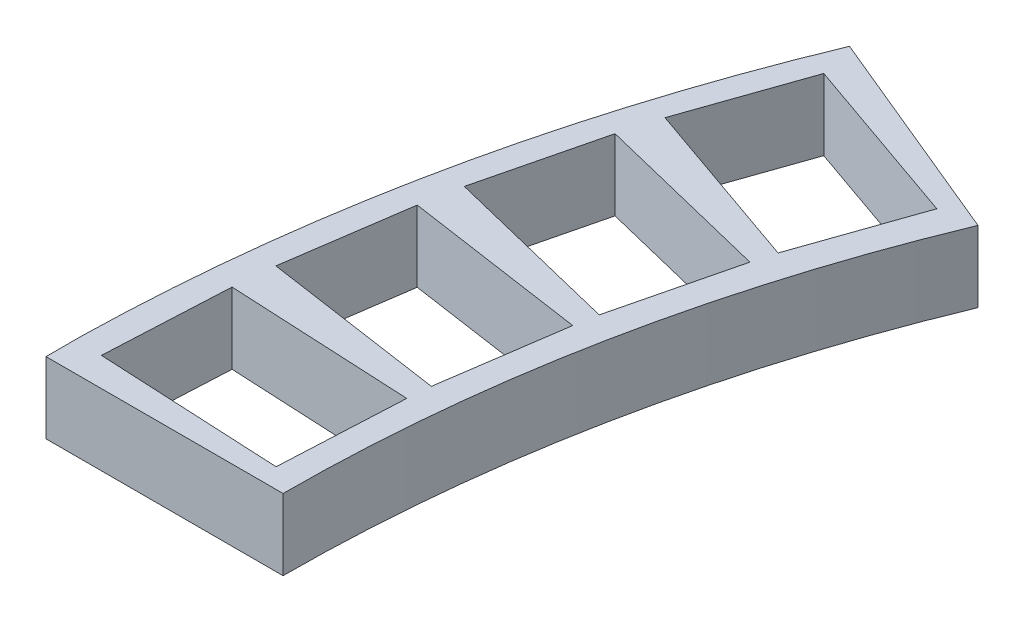
ISO-10303-21;
HEADER;
FILE_DESCRIPTION(('STEP AP214'),'2;1');
FILE_NAME('part.step','',(''),(''),'','','');
FILE_SCHEMA(('AUTOMOTIVE_DESIGN { 1 0 10303 214 1 1 1 1 }'));
ENDSEC;
DATA;
#1=APPLICATION_CONTEXT('core data for automotive mechanical design processes');
#2=APPLICATION_PROTOCOL_DEFINITION('international standard','automotive_design',2000,#1);
#3=PRODUCT_CONTEXT('',#1,'mechanical');
#4=PRODUCT('Part','Part','',(#3));
#5=PRODUCT_RELATED_PRODUCT_CATEGORY('part','',(#4));
#6=PRODUCT_DEFINITION_FORMATION('','',#4);
#7=PRODUCT_DEFINITION_CONTEXT('part definition',#1,'design');
#8=PRODUCT_DEFINITION('design','',#6,#7);
#9=PRODUCT_DEFINITION_SHAPE('','',#8);
#10=(LENGTH_UNIT() NAMED_UNIT(*) SI_UNIT(.MILLI.,.METRE.));
#11=(NAMED_UNIT(*) PLANE_ANGLE_UNIT() SI_UNIT($,.RADIAN.));
#12=(NAMED_UNIT(*) SI_UNIT($,.STERADIAN.) SOLID_ANGLE_UNIT());
#13=UNCERTAINTY_MEASURE_WITH_UNIT(LENGTH_MEASURE(1.E-05),#10,'distance_accuracy_value','');
#14=(GEOMETRIC_REPRESENTATION_CONTEXT(3) GLOBAL_UNCERTAINTY_ASSIGNED_CONTEXT((#13)) GLOBAL_UNIT_ASSIGNED_CONTEXT((#10,
#11,#12)) REPRESENTATION_CONTEXT('',''));
#15=CARTESIAN_POINT('',(0.,0.,0.));
#16=DIRECTION('',(0.,0.,1.));
#17=DIRECTION('',(1.,0.,0.));
#18=AXIS2_PLACEMENT_3D('',#15,#16,#17);
#19=CARTESIAN_POINT('',(0.,12.,0.));
#20=DIRECTION('',(0.,-1.,0.));
#21=DIRECTION('',(0.,0.,-1.));
#22=AXIS2_PLACEMENT_3D('',#19,#20,#21);
#23=PLANE('',#22);
#24=DIRECTION('',(0.998775470850136,0.,0.0494728089771555));
#25=VECTOR('',#24,1.);
#26=CARTESIAN_POINT('',(-259.677683337546,12.,-3.31462064663184));
#27=LINE('',#26,#25);
#28=CARTESIAN_POINT('',(-290.6397229339,12.,-4.84827772492366));
#29=VERTEX_POINT('',#28);
#30=CARTESIAN_POINT('',(-259.677683337546,12.,-3.31462064663184));
#31=VERTEX_POINT('',#30);
#32=EDGE_CURVE('E231',#29,#31,#27,.T.);
#33=ORIENTED_EDGE('',*,*,#32,.F.);
#34=DIRECTION('',(-0.0494728089771553,0.,0.998775470850135));
#35=VECTOR('',#34,1.);
#36=CARTESIAN_POINT('',(-290.6397229339,12.,-4.84827772492366));
#37=LINE('',#36,#35);
#38=CARTESIAN_POINT('',(-289.60079394538,12.,-25.8225626127765));
#39=VERTEX_POINT('',#38);
#40=EDGE_CURVE('E242',#39,#29,#37,.T.);
#41=ORIENTED_EDGE('',*,*,#40,.F.);
#42=DIRECTION('',(-0.998775470850136,0.,-0.0494728089771557));
#43=VECTOR('',#42,1.);
#44=CARTESIAN_POINT('',(-289.60079394538,12.,-25.8225626127765));
#45=LINE('',#44,#43);
#46=CARTESIAN_POINT('',(-258.638754349026,12.,-24.2889055344847));
#47=VERTEX_POINT('',#46);
#48=EDGE_CURVE('E238',#47,#39,#45,.T.);
#49=ORIENTED_EDGE('',*,*,#48,.F.);
#50=DIRECTION('',(0.0494728089771553,0.,-0.998775470850135));
#51=VECTOR('',#50,1.);
#52=CARTESIAN_POINT('',(-258.638754349026,12.,-24.2889055344847));
#53=LINE('',#52,#51);
#54=EDGE_CURVE('E234',#31,#47,#53,.T.);
#55=ORIENTED_EDGE('',*,*,#54,.F.);
#56=EDGE_LOOP('',(#33,#41,#49,#55));
#57=FACE_BOUND('',#56,.T.);
#58=DIRECTION('',(0.97123518890275,0.,0.238122253972701));
#59=VECTOR('',#58,1.);
#60=CARTESIAN_POINT('',(-254.615566778779,12.,-52.6883531890566));
#61=LINE('',#60,#59);
#62=CARTESIAN_POINT('',(-284.723857634765,12.,-60.0701430622103));
#63=VERTEX_POINT('',#62);
#64=CARTESIAN_POINT('',(-254.615566778779,12.,-52.6883531890566));
#65=VERTEX_POINT('',#64);
#66=EDGE_CURVE('E317',#63,#65,#61,.T.);
#67=ORIENTED_EDGE('',*,*,#66,.F.);
#68=DIRECTION('',(-0.238122253972697,0.,0.971235188902751));
#69=VECTOR('',#68,1.);
#70=CARTESIAN_POINT('',(-284.723857634765,12.,-60.0701430622103));
#71=LINE('',#70,#69);
#72=CARTESIAN_POINT('',(-279.723290301338,12.,-80.4660820291681));
#73=VERTEX_POINT('',#72);
#74=EDGE_CURVE('E328',#73,#63,#71,.T.);
#75=ORIENTED_EDGE('',*,*,#74,.F.);
#76=DIRECTION('',(-0.97123518890275,0.,-0.238122253972701));
#77=VECTOR('',#76,1.);
#78=CARTESIAN_POINT('',(-279.723290301338,12.,-80.4660820291681));
#79=LINE('',#78,#77);
#80=CARTESIAN_POINT('',(-249.614999445353,12.,-73.0842921560143));
#81=VERTEX_POINT('',#80);
#82=EDGE_CURVE('E324',#81,#73,#79,.T.);
#83=ORIENTED_EDGE('',*,*,#82,.F.);
#84=DIRECTION('',(0.238122253972699,0.,-0.971235188902751));
#85=VECTOR('',#84,1.);
#86=CARTESIAN_POINT('',(-249.614999445353,12.,-73.0842921560143));
#87=LINE('',#86,#85);
#88=EDGE_CURVE('E320',#65,#81,#87,.T.);
#89=ORIENTED_EDGE('',*,*,#88,.F.);
#90=EDGE_LOOP('',(#67,#75,#83,#89));
#91=FACE_BOUND('',#90,.T.);
#92=CARTESIAN_POINT('',(0.,12.,0.));
#93=DIRECTION('',(0.,1.,0.));
#94=DIRECTION('',(0.,0.,-1.));
#95=AXIS2_PLACEMENT_3D('',#92,#93,#94);
#96=CIRCLE('',#95,295.189854561563);
#97=CARTESIAN_POINT('',(-272.719864834412,12.,-112.964266742971));
#98=VERTEX_POINT('',#97);
#99=CARTESIAN_POINT('',(-295.127762341236,12.,-6.0542655650463));
#100=VERTEX_POINT('',#99);
#101=EDGE_CURVE('E360',#98,#100,#96,.T.);
#102=ORIENTED_EDGE('',*,*,#101,.T.);
#103=DIRECTION('',(0.,0.,1.));
#104=VECTOR('',#103,1.);
#105=CARTESIAN_POINT('',(-295.127762341236,12.,-6.0542655650463));
#106=LINE('',#105,#104);
#107=CARTESIAN_POINT('',(-295.127762341235,12.,-3.79080447587832E-12));
#108=VERTEX_POINT('',#107);
#109=EDGE_CURVE('E364',#100,#108,#106,.T.);
#110=ORIENTED_EDGE('',*,*,#109,.T.);
#111=DIRECTION('',(1.,0.,0.));
#112=VECTOR('',#111,1.);
#113=CARTESIAN_POINT('',(-295.127762341235,12.,-3.79080447587832E-12));
#114=LINE('',#113,#112);
#115=CARTESIAN_POINT('',(-255.189832201051,12.,0.));
#116=VERTEX_POINT('',#115);
#117=EDGE_CURVE('E368',#108,#116,#114,.T.);
#118=ORIENTED_EDGE('',*,*,#117,.T.);
#119=CARTESIAN_POINT('',(0.,12.,0.));
#120=DIRECTION('',(0.,-1.,0.));
#121=DIRECTION('',(0.,0.,1.));
#122=AXIS2_PLACEMENT_3D('',#119,#120,#121);
#123=CIRCLE('',#122,255.189832201051);
#124=CARTESIAN_POINT('',(-235.764662875541,12.,-97.6569208913699));
#125=VERTEX_POINT('',#124);
#126=EDGE_CURVE('E371',#116,#125,#123,.T.);
#127=ORIENTED_EDGE('',*,*,#126,.T.);
#128=DIRECTION('',(-0.923879532511287,0.,-0.38268343236509));
#129=VECTOR('',#128,1.);
#130=CARTESIAN_POINT('',(-272.719864834412,12.,-112.964266742971));
#131=LINE('',#130,#129);
#132=EDGE_CURVE('E374',#125,#98,#131,.T.);
#133=ORIENTED_EDGE('',*,*,#132,.T.);
#134=EDGE_LOOP('',(#102,#110,#118,#127,#133));
#135=FACE_BOUND('',#134,.T.);
#136=DIRECTION('',(0.989511320379551,0.,0.144455345490287));
#137=VECTOR('',#136,1.);
#138=CARTESIAN_POINT('',(-258.325942442025,12.,-28.1223982151977));
#139=LINE('',#138,#137);
#140=CARTESIAN_POINT('',(-289.000793373791,12.,-32.6005139253966));
#141=VERTEX_POINT('',#140);
#142=CARTESIAN_POINT('',(-258.325942442025,12.,-28.1223982151977));
#143=VERTEX_POINT('',#142);
#144=EDGE_CURVE('E274',#141,#143,#139,.T.);
#145=ORIENTED_EDGE('',*,*,#144,.F.);
#146=DIRECTION('',(-0.144455345490286,0.,0.989511320379551));
#147=VECTOR('',#146,1.);
#148=CARTESIAN_POINT('',(-289.000793373791,12.,-32.6005139253966));
#149=LINE('',#148,#147);
#150=CARTESIAN_POINT('',(-285.967231118495,12.,-53.3802516533672));
#151=VERTEX_POINT('',#150);
#152=EDGE_CURVE('E285',#151,#141,#149,.T.);
#153=ORIENTED_EDGE('',*,*,#152,.F.);
#154=DIRECTION('',(-0.989511320379551,0.,-0.144455345490288));
#155=VECTOR('',#154,1.);
#156=CARTESIAN_POINT('',(-285.967231118495,12.,-53.3802516533672));
#157=LINE('',#156,#155);
#158=CARTESIAN_POINT('',(-255.292380186729,12.,-48.9021359431683));
#159=VERTEX_POINT('',#158);
#160=EDGE_CURVE('E281',#159,#151,#157,.T.);
#161=ORIENTED_EDGE('',*,*,#160,.F.);
#162=DIRECTION('',(0.144455345490286,0.,-0.989511320379551));
#163=VECTOR('',#162,1.);
#164=CARTESIAN_POINT('',(-255.292380186729,12.,-48.9021359431683));
#165=LINE('',#164,#163);
#166=EDGE_CURVE('E277',#143,#159,#165,.T.);
#167=ORIENTED_EDGE('',*,*,#166,.F.);
#168=EDGE_LOOP('',(#145,#153,#161,#167));
#169=FACE_BOUND('',#168,.T.);
#170=DIRECTION('',(0.944113526410091,0.,0.329620462425351));
#171=VECTOR('',#170,1.);
#172=CARTESIAN_POINT('',(-248.580348619121,12.,-76.7887509680434));
#173=LINE('',#172,#171);
#174=CARTESIAN_POINT('',(-277.847867937834,12.,-87.0069853032293));
#175=VERTEX_POINT('',#174);
#176=CARTESIAN_POINT('',(-248.580348619121,12.,-76.7887509680434));
#177=VERTEX_POINT('',#176);
#178=EDGE_CURVE('E183',#175,#177,#173,.T.);
#179=ORIENTED_EDGE('',*,*,#178,.F.);
#180=DIRECTION('',(-0.329620462425351,0.,0.944113526410091));
#181=VECTOR('',#180,1.);
#182=CARTESIAN_POINT('',(-277.847867937834,12.,-87.0069853032293));
#183=LINE('',#182,#181);
#184=CARTESIAN_POINT('',(-270.925838226901,12.,-106.833369357841));
#185=VERTEX_POINT('',#184);
#186=EDGE_CURVE('E209',#185,#175,#183,.T.);
#187=ORIENTED_EDGE('',*,*,#186,.F.);
#188=DIRECTION('',(-0.944113526410091,0.,-0.329620462425351));
#189=VECTOR('',#188,1.);
#190=CARTESIAN_POINT('',(-270.925838226901,12.,-106.833369357841));
#191=LINE('',#190,#189);
#192=CARTESIAN_POINT('',(-241.658318908188,12.,-96.6151350226553));
#193=VERTEX_POINT('',#192);
#194=EDGE_CURVE('E205',#193,#185,#191,.T.);
#195=ORIENTED_EDGE('',*,*,#194,.F.);
#196=DIRECTION('',(0.329620462425351,0.,-0.944113526410091));
#197=VECTOR('',#196,1.);
#198=CARTESIAN_POINT('',(-241.658318908188,12.,-96.6151350226553));
#199=LINE('',#198,#197);
#200=EDGE_CURVE('E192',#177,#193,#199,.T.);
#201=ORIENTED_EDGE('',*,*,#200,.F.);
#202=EDGE_LOOP('',(#179,#187,#195,#201));
#203=FACE_BOUND('',#202,.T.);
#204=ADVANCED_FACE('F39',(#57,#91,#135,#169,#203),#23,.F.);
#205=CARTESIAN_POINT('',(0.,0.,0.));
#206=DIRECTION('',(0.,-1.,0.));
#207=DIRECTION('',(0.,0.,-1.));
#208=AXIS2_PLACEMENT_3D('',#205,#206,#207);
#209=PLANE('',#208);
#210=CARTESIAN_POINT('',(0.,0.,0.));
#211=DIRECTION('',(0.,1.,0.));
#212=DIRECTION('',(0.,0.,-1.));
#213=AXIS2_PLACEMENT_3D('',#210,#211,#212);
#214=CIRCLE('',#213,295.189854561563);
#215=CARTESIAN_POINT('',(-272.719864834412,0.,-112.964266742971));
#216=VERTEX_POINT('',#215);
#217=CARTESIAN_POINT('',(-295.127762341236,0.,-6.0542655650463));
#218=VERTEX_POINT('',#217);
#219=EDGE_CURVE('E359',#216,#218,#214,.T.);
#220=ORIENTED_EDGE('',*,*,#219,.F.);
#221=DIRECTION('',(-0.923879532511287,0.,-0.38268343236509));
#222=VECTOR('',#221,1.);
#223=CARTESIAN_POINT('',(-272.719864834412,0.,-112.964266742971));
#224=LINE('',#223,#222);
#225=CARTESIAN_POINT('',(-235.764662875541,0.,-97.6569208913699));
#226=VERTEX_POINT('',#225);
#227=EDGE_CURVE('E365',#226,#216,#224,.T.);
#228=ORIENTED_EDGE('',*,*,#227,.F.);
#229=CARTESIAN_POINT('',(0.,0.,0.));
#230=DIRECTION('',(0.,-1.,0.));
#231=DIRECTION('',(0.,0.,1.));
#232=AXIS2_PLACEMENT_3D('',#229,#230,#231);
#233=CIRCLE('',#232,255.189832201051);
#234=CARTESIAN_POINT('',(-255.189832201051,0.,0.));
#235=VERTEX_POINT('',#234);
#236=EDGE_CURVE('E387',#235,#226,#233,.T.);
#237=ORIENTED_EDGE('',*,*,#236,.F.);
#238=DIRECTION('',(1.,0.,0.));
#239=VECTOR('',#238,1.);
#240=CARTESIAN_POINT('',(-295.127762341235,0.,-3.79080447587832E-12));
#241=LINE('',#240,#239);
#242=CARTESIAN_POINT('',(-295.127762341235,0.,-3.79080447587832E-12));
#243=VERTEX_POINT('',#242);
#244=EDGE_CURVE('E384',#243,#235,#241,.T.);
#245=ORIENTED_EDGE('',*,*,#244,.F.);
#246=DIRECTION('',(0.,0.,1.));
#247=VECTOR('',#246,1.);
#248=CARTESIAN_POINT('',(-295.127762341236,0.,-6.0542655650463));
#249=LINE('',#248,#247);
#250=EDGE_CURVE('E381',#218,#243,#249,.T.);
#251=ORIENTED_EDGE('',*,*,#250,.F.);
#252=EDGE_LOOP('',(#220,#228,#237,#245,#251));
#253=FACE_BOUND('',#252,.T.);
#254=DIRECTION('',(-0.238122253972697,0.,0.971235188902751));
#255=VECTOR('',#254,1.);
#256=CARTESIAN_POINT('',(-284.723857634765,0.,-60.0701430622103));
#257=LINE('',#256,#255);
#258=CARTESIAN_POINT('',(-279.723290301338,0.,-80.4660820291681));
#259=VERTEX_POINT('',#258);
#260=CARTESIAN_POINT('',(-284.723857634765,0.,-60.0701430622103));
#261=VERTEX_POINT('',#260);
#262=EDGE_CURVE('E321',#259,#261,#257,.T.);
#263=ORIENTED_EDGE('',*,*,#262,.T.);
#264=DIRECTION('',(0.97123518890275,0.,0.238122253972701));
#265=VECTOR('',#264,1.);
#266=CARTESIAN_POINT('',(-254.615566778779,0.,-52.6883531890566));
#267=LINE('',#266,#265);
#268=CARTESIAN_POINT('',(-254.615566778779,0.,-52.6883531890566));
#269=VERTEX_POINT('',#268);
#270=EDGE_CURVE('E316',#261,#269,#267,.T.);
#271=ORIENTED_EDGE('',*,*,#270,.T.);
#272=DIRECTION('',(0.238122253972699,0.,-0.971235188902751));
#273=VECTOR('',#272,1.);
#274=CARTESIAN_POINT('',(-249.614999445353,0.,-73.0842921560143));
#275=LINE('',#274,#273);
#276=CARTESIAN_POINT('',(-249.614999445353,0.,-73.0842921560143));
#277=VERTEX_POINT('',#276);
#278=EDGE_CURVE('E335',#269,#277,#275,.T.);
#279=ORIENTED_EDGE('',*,*,#278,.T.);
#280=DIRECTION('',(-0.97123518890275,0.,-0.238122253972701));
#281=VECTOR('',#280,1.);
#282=CARTESIAN_POINT('',(-279.723290301338,0.,-80.4660820291681));
#283=LINE('',#282,#281);
#284=EDGE_CURVE('E339',#277,#259,#283,.T.);
#285=ORIENTED_EDGE('',*,*,#284,.T.);
#286=EDGE_LOOP('',(#263,#271,#279,#285));
#287=FACE_BOUND('',#286,.T.);
#288=DIRECTION('',(-0.144455345490286,0.,0.989511320379551));
#289=VECTOR('',#288,1.);
#290=CARTESIAN_POINT('',(-289.000793373791,0.,-32.6005139253966));
#291=LINE('',#290,#289);
#292=CARTESIAN_POINT('',(-285.967231118495,0.,-53.3802516533672));
#293=VERTEX_POINT('',#292);
#294=CARTESIAN_POINT('',(-289.000793373791,0.,-32.6005139253966));
#295=VERTEX_POINT('',#294);
#296=EDGE_CURVE('E278',#293,#295,#291,.T.);
#297=ORIENTED_EDGE('',*,*,#296,.T.);
#298=DIRECTION('',(0.989511320379551,0.,0.144455345490287));
#299=VECTOR('',#298,1.);
#300=CARTESIAN_POINT('',(-258.325942442025,0.,-28.1223982151977));
#301=LINE('',#300,#299);
#302=CARTESIAN_POINT('',(-258.325942442025,0.,-28.1223982151977));
#303=VERTEX_POINT('',#302);
#304=EDGE_CURVE('E273',#295,#303,#301,.T.);
#305=ORIENTED_EDGE('',*,*,#304,.T.);
#306=DIRECTION('',(0.144455345490286,0.,-0.989511320379551));
#307=VECTOR('',#306,1.);
#308=CARTESIAN_POINT('',(-255.292380186729,0.,-48.9021359431683));
#309=LINE('',#308,#307);
#310=CARTESIAN_POINT('',(-255.292380186729,0.,-48.9021359431683));
#311=VERTEX_POINT('',#310);
#312=EDGE_CURVE('E292',#303,#311,#309,.T.);
#313=ORIENTED_EDGE('',*,*,#312,.T.);
#314=DIRECTION('',(-0.989511320379551,0.,-0.144455345490288));
#315=VECTOR('',#314,1.);
#316=CARTESIAN_POINT('',(-285.967231118495,0.,-53.3802516533672));
#317=LINE('',#316,#315);
#318=EDGE_CURVE('E296',#311,#293,#317,.T.);
#319=ORIENTED_EDGE('',*,*,#318,.T.);
#320=EDGE_LOOP('',(#297,#305,#313,#319));
#321=FACE_BOUND('',#320,.T.);
#322=DIRECTION('',(-0.0494728089771553,0.,0.998775470850135));
#323=VECTOR('',#322,1.);
#324=CARTESIAN_POINT('',(-290.6397229339,0.,-4.84827772492366));
#325=LINE('',#324,#323);
#326=CARTESIAN_POINT('',(-289.60079394538,0.,-25.8225626127765));
#327=VERTEX_POINT('',#326);
#328=CARTESIAN_POINT('',(-290.6397229339,0.,-4.84827772492366));
#329=VERTEX_POINT('',#328);
#330=EDGE_CURVE('E235',#327,#329,#325,.T.);
#331=ORIENTED_EDGE('',*,*,#330,.T.);
#332=DIRECTION('',(0.998775470850136,0.,0.0494728089771555));
#333=VECTOR('',#332,1.);
#334=CARTESIAN_POINT('',(-259.677683337546,0.,-3.31462064663184));
#335=LINE('',#334,#333);
#336=CARTESIAN_POINT('',(-259.677683337546,0.,-3.31462064663184));
#337=VERTEX_POINT('',#336);
#338=EDGE_CURVE('E201',#329,#337,#335,.T.);
#339=ORIENTED_EDGE('',*,*,#338,.T.);
#340=DIRECTION('',(0.0494728089771553,0.,-0.998775470850135));
#341=VECTOR('',#340,1.);
#342=CARTESIAN_POINT('',(-258.638754349026,0.,-24.2889055344847));
#343=LINE('',#342,#341);
#344=CARTESIAN_POINT('',(-258.638754349026,0.,-24.2889055344847));
#345=VERTEX_POINT('',#344);
#346=EDGE_CURVE('E249',#337,#345,#343,.T.);
#347=ORIENTED_EDGE('',*,*,#346,.T.);
#348=DIRECTION('',(-0.998775470850136,0.,-0.0494728089771557));
#349=VECTOR('',#348,1.);
#350=CARTESIAN_POINT('',(-289.60079394538,0.,-25.8225626127765));
#351=LINE('',#350,#349);
#352=EDGE_CURVE('E253',#345,#327,#351,.T.);
#353=ORIENTED_EDGE('',*,*,#352,.T.);
#354=EDGE_LOOP('',(#331,#339,#347,#353));
#355=FACE_BOUND('',#354,.T.);
#356=DIRECTION('',(-0.329620462425351,0.,0.944113526410091));
#357=VECTOR('',#356,1.);
#358=CARTESIAN_POINT('',(-277.847867937834,0.,-87.0069853032293));
#359=LINE('',#358,#357);
#360=CARTESIAN_POINT('',(-270.925838226901,0.,-106.833369357841));
#361=VERTEX_POINT('',#360);
#362=CARTESIAN_POINT('',(-277.847867937834,0.,-87.0069853032293));
#363=VERTEX_POINT('',#362);
#364=EDGE_CURVE('E193',#361,#363,#359,.T.);
#365=ORIENTED_EDGE('',*,*,#364,.T.);
#366=DIRECTION('',(0.944113526410091,0.,0.329620462425351));
#367=VECTOR('',#366,1.);
#368=CARTESIAN_POINT('',(-248.580348619121,0.,-76.7887509680434));
#369=LINE('',#368,#367);
#370=CARTESIAN_POINT('',(-248.580348619121,0.,-76.7887509680434));
#371=VERTEX_POINT('',#370);
#372=EDGE_CURVE('E63',#363,#371,#369,.T.);
#373=ORIENTED_EDGE('',*,*,#372,.T.);
#374=DIRECTION('',(0.329620462425351,0.,-0.944113526410091));
#375=VECTOR('',#374,1.);
#376=CARTESIAN_POINT('',(-241.658318908188,0.,-96.6151350226553));
#377=LINE('',#376,#375);
#378=CARTESIAN_POINT('',(-241.658318908188,0.,-96.6151350226553));
#379=VERTEX_POINT('',#378);
#380=EDGE_CURVE('E199',#371,#379,#377,.T.);
#381=ORIENTED_EDGE('',*,*,#380,.T.);
#382=DIRECTION('',(-0.944113526410091,0.,-0.329620462425351));
#383=VECTOR('',#382,1.);
#384=CARTESIAN_POINT('',(-270.925838226901,0.,-106.833369357841));
#385=LINE('',#384,#383);
#386=EDGE_CURVE('E218',#379,#361,#385,.T.);
#387=ORIENTED_EDGE('',*,*,#386,.T.);
#388=EDGE_LOOP('',(#365,#373,#381,#387));
#389=FACE_BOUND('',#388,.T.);
#390=ADVANCED_FACE('F414',(#253,#287,#321,#355,#389),#209,.T.);
#391=CARTESIAN_POINT('',(0.,12.,0.));
#392=DIRECTION('',(0.,-1.,0.));
#393=DIRECTION('',(0.,0.,-1.));
#394=AXIS2_PLACEMENT_3D('',#391,#392,#393);
#395=CYLINDRICAL_SURFACE('',#394,295.189854561563);
#396=ORIENTED_EDGE('',*,*,#219,.T.);
#397=DIRECTION('',(0.,-1.,0.));
#398=VECTOR('',#397,1.);
#399=CARTESIAN_POINT('',(-295.127762341236,12.,-6.0542655650463));
#400=LINE('',#399,#398);
#401=EDGE_CURVE('E11',#100,#218,#400,.T.);
#402=ORIENTED_EDGE('',*,*,#401,.F.);
#403=ORIENTED_EDGE('',*,*,#101,.F.);
#404=DIRECTION('',(0.,-1.,0.));
#405=VECTOR('',#404,1.);
#406=CARTESIAN_POINT('',(-272.719864834412,12.,-112.964266742971));
#407=LINE('',#406,#405);
#408=EDGE_CURVE('E377',#98,#216,#407,.T.);
#409=ORIENTED_EDGE('',*,*,#408,.T.);
#410=EDGE_LOOP('',(#396,#402,#403,#409));
#411=FACE_BOUND('',#410,.T.);
#412=ADVANCED_FACE('F41',(#411),#395,.T.);
#413=CARTESIAN_POINT('',(-295.127762341236,12.,-6.0542655650463));
#414=DIRECTION('',(1.,0.,0.));
#415=DIRECTION('',(0.,0.,-1.));
#416=AXIS2_PLACEMENT_3D('',#413,#414,#415);
#417=PLANE('',#416);
#418=ORIENTED_EDGE('',*,*,#250,.T.);
#419=DIRECTION('',(0.,-1.,0.));
#420=VECTOR('',#419,1.);
#421=CARTESIAN_POINT('',(-295.127762341235,12.,-3.79080447587832E-12));
#422=LINE('',#421,#420);
#423=EDGE_CURVE('E48',#108,#243,#422,.T.);
#424=ORIENTED_EDGE('',*,*,#423,.F.);
#425=ORIENTED_EDGE('',*,*,#109,.F.);
#426=ORIENTED_EDGE('',*,*,#401,.T.);
#427=EDGE_LOOP('',(#418,#424,#425,#426));
#428=FACE_BOUND('',#427,.T.);
#429=ADVANCED_FACE('F429',(#428),#417,.F.);
#430=CARTESIAN_POINT('',(-295.127762341235,12.,-3.79080447587832E-12));
#431=DIRECTION('',(0.,0.,-1.));
#432=DIRECTION('',(-1.,0.,0.));
#433=AXIS2_PLACEMENT_3D('',#430,#431,#432);
#434=PLANE('',#433);
#435=ORIENTED_EDGE('',*,*,#244,.T.);
#436=DIRECTION('',(0.,-1.,0.));
#437=VECTOR('',#436,1.);
#438=CARTESIAN_POINT('',(-255.189832201051,12.,0.));
#439=LINE('',#438,#437);
#440=EDGE_CURVE('E399',#116,#235,#439,.T.);
#441=ORIENTED_EDGE('',*,*,#440,.F.);
#442=ORIENTED_EDGE('',*,*,#117,.F.);
#443=ORIENTED_EDGE('',*,*,#423,.T.);
#444=EDGE_LOOP('',(#435,#441,#442,#443));
#445=FACE_BOUND('',#444,.T.);
#446=ADVANCED_FACE('F408',(#445),#434,.F.);
#447=CARTESIAN_POINT('',(0.,12.,0.));
#448=DIRECTION('',(0.,-1.,0.));
#449=DIRECTION('',(0.,0.,-1.));
#450=AXIS2_PLACEMENT_3D('',#447,#448,#449);
#451=CYLINDRICAL_SURFACE('',#450,255.189832201051);
#452=ORIENTED_EDGE('',*,*,#236,.T.);
#453=DIRECTION('',(0.,-1.,0.));
#454=VECTOR('',#453,1.);
#455=CARTESIAN_POINT('',(-235.764662875541,12.,-97.6569208913699));
#456=LINE('',#455,#454);
#457=EDGE_CURVE('E395',#125,#226,#456,.T.);
#458=ORIENTED_EDGE('',*,*,#457,.F.);
#459=ORIENTED_EDGE('',*,*,#126,.F.);
#460=ORIENTED_EDGE('',*,*,#440,.T.);
#461=EDGE_LOOP('',(#452,#458,#459,#460));
#462=FACE_BOUND('',#461,.T.);
#463=ADVANCED_FACE('F419',(#462),#451,.F.);
#464=CARTESIAN_POINT('',(-272.719864834412,12.,-112.964266742971));
#465=DIRECTION('',(-0.38268343236509,0.,0.923879532511287));
#466=DIRECTION('',(0.923879532511287,0.,0.38268343236509));
#467=AXIS2_PLACEMENT_3D('',#464,#465,#466);
#468=PLANE('',#467);
#469=ORIENTED_EDGE('',*,*,#227,.T.);
#470=ORIENTED_EDGE('',*,*,#408,.F.);
#471=ORIENTED_EDGE('',*,*,#132,.F.);
#472=ORIENTED_EDGE('',*,*,#457,.T.);
#473=EDGE_LOOP('',(#469,#470,#471,#472));
#474=FACE_BOUND('',#473,.T.);
#475=ADVANCED_FACE('F423',(#474),#468,.F.);
#476=CARTESIAN_POINT('',(-254.615566778779,12.,-52.6883531890566));
#477=DIRECTION('',(0.238122253972701,0.,-0.97123518890275));
#478=DIRECTION('',(-0.97123518890275,0.,-0.238122253972701));
#479=AXIS2_PLACEMENT_3D('',#476,#477,#478);
#480=PLANE('',#479);
#481=ORIENTED_EDGE('',*,*,#270,.F.);
#482=DIRECTION('',(0.,-1.,0.));
#483=VECTOR('',#482,1.);
#484=CARTESIAN_POINT('',(-284.723857634765,12.,-60.0701430622103));
#485=LINE('',#484,#483);
#486=EDGE_CURVE('E331',#63,#261,#485,.T.);
#487=ORIENTED_EDGE('',*,*,#486,.F.);
#488=ORIENTED_EDGE('',*,*,#66,.T.);
#489=DIRECTION('',(0.,-1.,0.));
#490=VECTOR('',#489,1.);
#491=CARTESIAN_POINT('',(-254.615566778779,12.,-52.6883531890566));
#492=LINE('',#491,#490);
#493=EDGE_CURVE('E355',#65,#269,#492,.T.);
#494=ORIENTED_EDGE('',*,*,#493,.T.);
#495=EDGE_LOOP('',(#481,#487,#488,#494));
#496=FACE_BOUND('',#495,.T.);
#497=ADVANCED_FACE('F445',(#496),#480,.T.);
#498=CARTESIAN_POINT('',(-249.614999445353,12.,-73.0842921560143));
#499=DIRECTION('',(-0.971235188902751,0.,-0.238122253972698));
#500=DIRECTION('',(-0.238122253972699,0.,0.971235188902751));
#501=AXIS2_PLACEMENT_3D('',#498,#499,#500);
#502=PLANE('',#501);
#503=ORIENTED_EDGE('',*,*,#278,.F.);
#504=ORIENTED_EDGE('',*,*,#493,.F.);
#505=ORIENTED_EDGE('',*,*,#88,.T.);
#506=DIRECTION('',(0.,-1.,0.));
#507=VECTOR('',#506,1.);
#508=CARTESIAN_POINT('',(-249.614999445353,12.,-73.0842921560143));
#509=LINE('',#508,#507);
#510=EDGE_CURVE('E352',#81,#277,#509,.T.);
#511=ORIENTED_EDGE('',*,*,#510,.T.);
#512=EDGE_LOOP('',(#503,#504,#505,#511));
#513=FACE_BOUND('',#512,.T.);
#514=ADVANCED_FACE('F471',(#513),#502,.T.);
#515=CARTESIAN_POINT('',(-279.723290301338,12.,-80.4660820291681));
#516=DIRECTION('',(-0.238122253972701,0.,0.97123518890275));
#517=DIRECTION('',(0.97123518890275,0.,0.238122253972701));
#518=AXIS2_PLACEMENT_3D('',#515,#516,#517);
#519=PLANE('',#518);
#520=ORIENTED_EDGE('',*,*,#284,.F.);
#521=ORIENTED_EDGE('',*,*,#510,.F.);
#522=ORIENTED_EDGE('',*,*,#82,.T.);
#523=DIRECTION('',(0.,-1.,0.));
#524=VECTOR('',#523,1.);
#525=CARTESIAN_POINT('',(-279.723290301338,12.,-80.4660820291681));
#526=LINE('',#525,#524);
#527=EDGE_CURVE('E349',#73,#259,#526,.T.);
#528=ORIENTED_EDGE('',*,*,#527,.T.);
#529=EDGE_LOOP('',(#520,#521,#522,#528));
#530=FACE_BOUND('',#529,.T.);
#531=ADVANCED_FACE('F478',(#530),#519,.T.);
#532=CARTESIAN_POINT('',(-284.723857634765,12.,-60.0701430622103));
#533=DIRECTION('',(0.971235188902751,0.,0.238122253972697));
#534=DIRECTION('',(0.238122253972697,0.,-0.971235188902751));
#535=AXIS2_PLACEMENT_3D('',#532,#533,#534);
#536=PLANE('',#535);
#537=ORIENTED_EDGE('',*,*,#262,.F.);
#538=ORIENTED_EDGE('',*,*,#527,.F.);
#539=ORIENTED_EDGE('',*,*,#74,.T.);
#540=ORIENTED_EDGE('',*,*,#486,.T.);
#541=EDGE_LOOP('',(#537,#538,#539,#540));
#542=FACE_BOUND('',#541,.T.);
#543=ADVANCED_FACE('F485',(#542),#536,.T.);
#544=CARTESIAN_POINT('',(-258.325942442025,12.,-28.1223982151977));
#545=DIRECTION('',(0.144455345490287,0.,-0.989511320379551));
#546=DIRECTION('',(-0.989511320379551,0.,-0.144455345490287));
#547=AXIS2_PLACEMENT_3D('',#544,#545,#546);
#548=PLANE('',#547);
#549=ORIENTED_EDGE('',*,*,#304,.F.);
#550=DIRECTION('',(0.,-1.,0.));
#551=VECTOR('',#550,1.);
#552=CARTESIAN_POINT('',(-289.000793373791,12.,-32.6005139253966));
#553=LINE('',#552,#551);
#554=EDGE_CURVE('E288',#141,#295,#553,.T.);
#555=ORIENTED_EDGE('',*,*,#554,.F.);
#556=ORIENTED_EDGE('',*,*,#144,.T.);
#557=DIRECTION('',(0.,-1.,0.));
#558=VECTOR('',#557,1.);
#559=CARTESIAN_POINT('',(-258.325942442025,12.,-28.1223982151977));
#560=LINE('',#559,#558);
#561=EDGE_CURVE('E312',#143,#303,#560,.T.);
#562=ORIENTED_EDGE('',*,*,#561,.T.);
#563=EDGE_LOOP('',(#549,#555,#556,#562));
#564=FACE_BOUND('',#563,.T.);
#565=ADVANCED_FACE('F493',(#564),#548,.T.);
#566=CARTESIAN_POINT('',(-255.292380186729,12.,-48.9021359431683));
#567=DIRECTION('',(-0.989511320379551,0.,-0.144455345490286));
#568=DIRECTION('',(-0.144455345490286,0.,0.989511320379551));
#569=AXIS2_PLACEMENT_3D('',#566,#567,#568);
#570=PLANE('',#569);
#571=ORIENTED_EDGE('',*,*,#312,.F.);
#572=ORIENTED_EDGE('',*,*,#561,.F.);
#573=ORIENTED_EDGE('',*,*,#166,.T.);
#574=DIRECTION('',(0.,-1.,0.));
#575=VECTOR('',#574,1.);
#576=CARTESIAN_POINT('',(-255.292380186729,12.,-48.9021359431683));
#577=LINE('',#576,#575);
#578=EDGE_CURVE('E309',#159,#311,#577,.T.);
#579=ORIENTED_EDGE('',*,*,#578,.T.);
#580=EDGE_LOOP('',(#571,#572,#573,#579));
#581=FACE_BOUND('',#580,.T.);
#582=ADVANCED_FACE('F501',(#581),#570,.T.);
#583=CARTESIAN_POINT('',(-285.967231118495,12.,-53.3802516533672));
#584=DIRECTION('',(-0.144455345490288,0.,0.98951132037955));
#585=DIRECTION('',(0.989511320379551,0.,0.144455345490288));
#586=AXIS2_PLACEMENT_3D('',#583,#584,#585);
#587=PLANE('',#586);
#588=ORIENTED_EDGE('',*,*,#318,.F.);
#589=ORIENTED_EDGE('',*,*,#578,.F.);
#590=ORIENTED_EDGE('',*,*,#160,.T.);
#591=DIRECTION('',(0.,-1.,0.));
#592=VECTOR('',#591,1.);
#593=CARTESIAN_POINT('',(-285.967231118495,12.,-53.3802516533672));
#594=LINE('',#593,#592);
#595=EDGE_CURVE('E306',#151,#293,#594,.T.);
#596=ORIENTED_EDGE('',*,*,#595,.T.);
#597=EDGE_LOOP('',(#588,#589,#590,#596));
#598=FACE_BOUND('',#597,.T.);
#599=ADVANCED_FACE('F509',(#598),#587,.T.);
#600=CARTESIAN_POINT('',(-289.000793373791,12.,-32.6005139253966));
#601=DIRECTION('',(0.989511320379551,0.,0.144455345490286));
#602=DIRECTION('',(0.144455345490286,0.,-0.989511320379551));
#603=AXIS2_PLACEMENT_3D('',#600,#601,#602);
#604=PLANE('',#603);
#605=ORIENTED_EDGE('',*,*,#296,.F.);
#606=ORIENTED_EDGE('',*,*,#595,.F.);
#607=ORIENTED_EDGE('',*,*,#152,.T.);
#608=ORIENTED_EDGE('',*,*,#554,.T.);
#609=EDGE_LOOP('',(#605,#606,#607,#608));
#610=FACE_BOUND('',#609,.T.);
#611=ADVANCED_FACE('F517',(#610),#604,.T.);
#612=CARTESIAN_POINT('',(-259.677683337546,12.,-3.31462064663184));
#613=DIRECTION('',(0.0494728089771555,0.,-0.998775470850135));
#614=DIRECTION('',(-0.998775470850136,0.,-0.0494728089771555));
#615=AXIS2_PLACEMENT_3D('',#612,#613,#614);
#616=PLANE('',#615);
#617=ORIENTED_EDGE('',*,*,#338,.F.);
#618=DIRECTION('',(0.,-1.,0.));
#619=VECTOR('',#618,1.);
#620=CARTESIAN_POINT('',(-290.6397229339,12.,-4.84827772492366));
#621=LINE('',#620,#619);
#622=EDGE_CURVE('E245',#29,#329,#621,.T.);
#623=ORIENTED_EDGE('',*,*,#622,.F.);
#624=ORIENTED_EDGE('',*,*,#32,.T.);
#625=DIRECTION('',(0.,-1.,0.));
#626=VECTOR('',#625,1.);
#627=CARTESIAN_POINT('',(-259.677683337546,12.,-3.31462064663184));
#628=LINE('',#627,#626);
#629=EDGE_CURVE('E269',#31,#337,#628,.T.);
#630=ORIENTED_EDGE('',*,*,#629,.T.);
#631=EDGE_LOOP('',(#617,#623,#624,#630));
#632=FACE_BOUND('',#631,.T.);
#633=ADVANCED_FACE('F525',(#632),#616,.T.);
#634=CARTESIAN_POINT('',(-258.638754349026,12.,-24.2889055344847));
#635=DIRECTION('',(-0.998775470850136,0.,-0.0494728089771553));
#636=DIRECTION('',(-0.0494728089771553,0.,0.998775470850136));
#637=AXIS2_PLACEMENT_3D('',#634,#635,#636);
#638=PLANE('',#637);
#639=ORIENTED_EDGE('',*,*,#346,.F.);
#640=ORIENTED_EDGE('',*,*,#629,.F.);
#641=ORIENTED_EDGE('',*,*,#54,.T.);
#642=DIRECTION('',(0.,-1.,0.));
#643=VECTOR('',#642,1.);
#644=CARTESIAN_POINT('',(-258.638754349026,12.,-24.2889055344847));
#645=LINE('',#644,#643);
#646=EDGE_CURVE('E266',#47,#345,#645,.T.);
#647=ORIENTED_EDGE('',*,*,#646,.T.);
#648=EDGE_LOOP('',(#639,#640,#641,#647));
#649=FACE_BOUND('',#648,.T.);
#650=ADVANCED_FACE('F533',(#649),#638,.T.);
#651=CARTESIAN_POINT('',(-289.60079394538,12.,-25.8225626127765));
#652=DIRECTION('',(-0.0494728089771557,0.,0.998775470850135));
#653=DIRECTION('',(0.998775470850136,0.,0.0494728089771557));
#654=AXIS2_PLACEMENT_3D('',#651,#652,#653);
#655=PLANE('',#654);
#656=ORIENTED_EDGE('',*,*,#352,.F.);
#657=ORIENTED_EDGE('',*,*,#646,.F.);
#658=ORIENTED_EDGE('',*,*,#48,.T.);
#659=DIRECTION('',(0.,-1.,0.));
#660=VECTOR('',#659,1.);
#661=CARTESIAN_POINT('',(-289.60079394538,12.,-25.8225626127765));
#662=LINE('',#661,#660);
#663=EDGE_CURVE('E263',#39,#327,#662,.T.);
#664=ORIENTED_EDGE('',*,*,#663,.T.);
#665=EDGE_LOOP('',(#656,#657,#658,#664));
#666=FACE_BOUND('',#665,.T.);
#667=ADVANCED_FACE('F541',(#666),#655,.T.);
#668=CARTESIAN_POINT('',(-290.6397229339,12.,-4.84827772492366));
#669=DIRECTION('',(0.998775470850136,0.,0.0494728089771553));
#670=DIRECTION('',(0.0494728089771553,0.,-0.998775470850136));
#671=AXIS2_PLACEMENT_3D('',#668,#669,#670);
#672=PLANE('',#671);
#673=ORIENTED_EDGE('',*,*,#330,.F.);
#674=ORIENTED_EDGE('',*,*,#663,.F.);
#675=ORIENTED_EDGE('',*,*,#40,.T.);
#676=ORIENTED_EDGE('',*,*,#622,.T.);
#677=EDGE_LOOP('',(#673,#674,#675,#676));
#678=FACE_BOUND('',#677,.T.);
#679=ADVANCED_FACE('F549',(#678),#672,.T.);
#680=CARTESIAN_POINT('',(-248.580348619121,12.,-76.7887509680434));
#681=DIRECTION('',(0.329620462425351,0.,-0.944113526410091));
#682=DIRECTION('',(-0.944113526410091,0.,-0.329620462425351));
#683=AXIS2_PLACEMENT_3D('',#680,#681,#682);
#684=PLANE('',#683);
#685=ORIENTED_EDGE('',*,*,#372,.F.);
#686=DIRECTION('',(0.,-1.,0.));
#687=VECTOR('',#686,1.);
#688=CARTESIAN_POINT('',(-277.847867937834,12.,-87.0069853032293));
#689=LINE('',#688,#687);
#690=EDGE_CURVE('E187',#175,#363,#689,.T.);
#691=ORIENTED_EDGE('',*,*,#690,.F.);
#692=ORIENTED_EDGE('',*,*,#178,.T.);
#693=DIRECTION('',(0.,-1.,0.));
#694=VECTOR('',#693,1.);
#695=CARTESIAN_POINT('',(-248.580348619121,12.,-76.7887509680434));
#696=LINE('',#695,#694);
#697=EDGE_CURVE('E186',#177,#371,#696,.T.);
#698=ORIENTED_EDGE('',*,*,#697,.T.);
#699=EDGE_LOOP('',(#685,#691,#692,#698));
#700=FACE_BOUND('',#699,.T.);
#701=ADVANCED_FACE('F185',(#700),#684,.T.);
#702=CARTESIAN_POINT('',(-241.658318908188,12.,-96.6151350226553));
#703=DIRECTION('',(-0.944113526410091,0.,-0.329620462425351));
#704=DIRECTION('',(-0.329620462425351,0.,0.944113526410091));
#705=AXIS2_PLACEMENT_3D('',#702,#703,#704);
#706=PLANE('',#705);
#707=ORIENTED_EDGE('',*,*,#380,.F.);
#708=ORIENTED_EDGE('',*,*,#697,.F.);
#709=ORIENTED_EDGE('',*,*,#200,.T.);
#710=DIRECTION('',(0.,-1.,0.));
#711=VECTOR('',#710,1.);
#712=CARTESIAN_POINT('',(-241.658318908188,12.,-96.6151350226553));
#713=LINE('',#712,#711);
#714=EDGE_CURVE('E202',#193,#379,#713,.T.);
#715=ORIENTED_EDGE('',*,*,#714,.T.);
#716=EDGE_LOOP('',(#707,#708,#709,#715));
#717=FACE_BOUND('',#716,.T.);
#718=ADVANCED_FACE('F196',(#717),#706,.T.);
#719=CARTESIAN_POINT('',(-270.925838226901,12.,-106.833369357841));
#720=DIRECTION('',(-0.329620462425351,0.,0.944113526410091));
#721=DIRECTION('',(0.944113526410091,0.,0.329620462425351));
#722=AXIS2_PLACEMENT_3D('',#719,#720,#721);
#723=PLANE('',#722);
#724=ORIENTED_EDGE('',*,*,#386,.F.);
#725=ORIENTED_EDGE('',*,*,#714,.F.);
#726=ORIENTED_EDGE('',*,*,#194,.T.);
#727=DIRECTION('',(0.,-1.,0.));
#728=VECTOR('',#727,1.);
#729=CARTESIAN_POINT('',(-270.925838226901,12.,-106.833369357841));
#730=LINE('',#729,#728);
#731=EDGE_CURVE('E55',#185,#361,#730,.T.);
#732=ORIENTED_EDGE('',*,*,#731,.T.);
#733=EDGE_LOOP('',(#724,#725,#726,#732));
#734=FACE_BOUND('',#733,.T.);
#735=ADVANCED_FACE('F570',(#734),#723,.T.);
#736=CARTESIAN_POINT('',(-277.847867937834,12.,-87.0069853032293));
#737=DIRECTION('',(0.944113526410091,0.,0.329620462425351));
#738=DIRECTION('',(0.329620462425351,0.,-0.944113526410091));
#739=AXIS2_PLACEMENT_3D('',#736,#737,#738);
#740=PLANE('',#739);
#741=ORIENTED_EDGE('',*,*,#364,.F.);
#742=ORIENTED_EDGE('',*,*,#731,.F.);
#743=ORIENTED_EDGE('',*,*,#186,.T.);
#744=ORIENTED_EDGE('',*,*,#690,.T.);
#745=EDGE_LOOP('',(#741,#742,#743,#744));
#746=FACE_BOUND('',#745,.T.);
#747=ADVANCED_FACE('F577',(#746),#740,.T.);
#748=CLOSED_SHELL('',(#204,#390,#412,#429,#446,#463,#475,#497,#514,#531,#543,#565,#582,#599,
#611,#633,#650,#667,#679,#701,#718,#735,#747));
#749=MANIFOLD_SOLID_BREP('B2',#748);
#750=ADVANCED_BREP_SHAPE_REPRESENTATION('',(#18,#749),#14);
#751=SHAPE_DEFINITION_REPRESENTATION(#9,#750);
ENDSEC;
END-ISO-10303-21;
